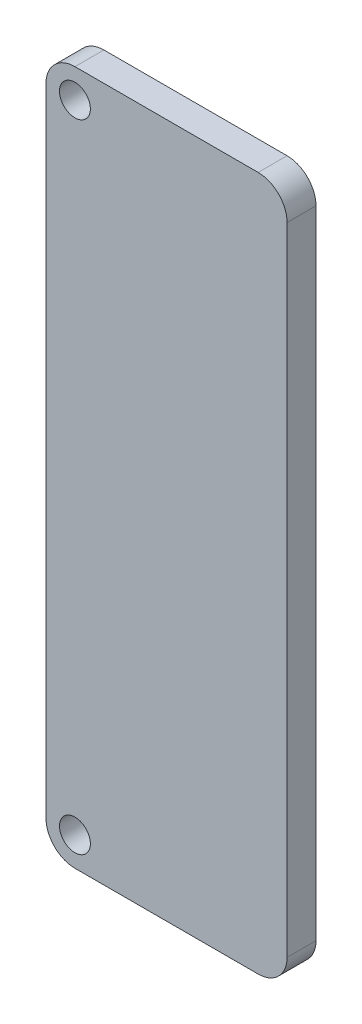
ISO-10303-21;
HEADER;
FILE_DESCRIPTION(('STEP AP214'),'2;1');
FILE_NAME('part.step','',(''),(''),'','','');
FILE_SCHEMA(('AUTOMOTIVE_DESIGN { 1 0 10303 214 1 1 1 1 }'));
ENDSEC;
DATA;
#1=APPLICATION_CONTEXT('core data for automotive mechanical design processes');
#2=APPLICATION_PROTOCOL_DEFINITION('international standard','automotive_design',2000,#1);
#3=PRODUCT_CONTEXT('',#1,'mechanical');
#4=PRODUCT('Part','Part','',(#3));
#5=PRODUCT_RELATED_PRODUCT_CATEGORY('part','',(#4));
#6=PRODUCT_DEFINITION_FORMATION('','',#4);
#7=PRODUCT_DEFINITION_CONTEXT('part definition',#1,'design');
#8=PRODUCT_DEFINITION('design','',#6,#7);
#9=PRODUCT_DEFINITION_SHAPE('','',#8);
#10=(LENGTH_UNIT() NAMED_UNIT(*) SI_UNIT(.MILLI.,.METRE.));
#11=(NAMED_UNIT(*) PLANE_ANGLE_UNIT() SI_UNIT($,.RADIAN.));
#12=(NAMED_UNIT(*) SI_UNIT($,.STERADIAN.) SOLID_ANGLE_UNIT());
#13=UNCERTAINTY_MEASURE_WITH_UNIT(LENGTH_MEASURE(1.E-05),#10,'distance_accuracy_value','');
#14=(GEOMETRIC_REPRESENTATION_CONTEXT(3) GLOBAL_UNCERTAINTY_ASSIGNED_CONTEXT((#13)) GLOBAL_UNIT_ASSIGNED_CONTEXT((#10,
#11,#12)) REPRESENTATION_CONTEXT('',''));
#15=CARTESIAN_POINT('',(0.,0.,0.));
#16=DIRECTION('',(0.,0.,1.));
#17=DIRECTION('',(1.,0.,0.));
#18=AXIS2_PLACEMENT_3D('',#15,#16,#17);
#19=CARTESIAN_POINT('',(-24.4,-30.5,2.));
#20=DIRECTION('',(-1.,0.,0.));
#21=DIRECTION('',(0.,0.,1.));
#22=AXIS2_PLACEMENT_3D('',#19,#20,#21);
#23=PLANE('',#22);
#24=DIRECTION('',(0.,1.,0.));
#25=VECTOR('',#24,1.);
#26=CARTESIAN_POINT('',(-24.4,-30.5,0.));
#27=LINE('',#26,#25);
#28=CARTESIAN_POINT('',(-24.4,-30.5,0.));
#29=VERTEX_POINT('',#28);
#30=CARTESIAN_POINT('',(-24.4,-4.25,0.));
#31=VERTEX_POINT('',#30);
#32=EDGE_CURVE('E302',#29,#31,#27,.T.);
#33=ORIENTED_EDGE('',*,*,#32,.T.);
#34=DIRECTION('',(0.,0.,1.));
#35=VECTOR('',#34,1.);
#36=CARTESIAN_POINT('',(-24.4,-4.25,2.));
#37=LINE('',#36,#35);
#38=CARTESIAN_POINT('',(-24.4,-4.25,2.));
#39=VERTEX_POINT('',#38);
#40=EDGE_CURVE('E261',#31,#39,#37,.T.);
#41=ORIENTED_EDGE('',*,*,#40,.T.);
#42=DIRECTION('',(0.,1.,0.));
#43=VECTOR('',#42,1.);
#44=CARTESIAN_POINT('',(-24.4,-30.5,2.));
#45=LINE('',#44,#43);
#46=CARTESIAN_POINT('',(-24.4,-30.5,2.));
#47=VERTEX_POINT('',#46);
#48=EDGE_CURVE('E276',#47,#39,#45,.T.);
#49=ORIENTED_EDGE('',*,*,#48,.F.);
#50=DIRECTION('',(0.,0.,-1.));
#51=VECTOR('',#50,1.);
#52=CARTESIAN_POINT('',(-24.4,-30.5,2.));
#53=LINE('',#52,#51);
#54=EDGE_CURVE('E326',#47,#29,#53,.T.);
#55=ORIENTED_EDGE('',*,*,#54,.T.);
#56=EDGE_LOOP('',(#33,#41,#49,#55));
#57=FACE_BOUND('',#56,.T.);
#58=ADVANCED_FACE('F43',(#57),#23,.F.);
#59=CARTESIAN_POINT('',(-22.,-33.,3.));
#60=DIRECTION('',(0.,0.,1.));
#61=DIRECTION('',(1.,0.,0.));
#62=AXIS2_PLACEMENT_3D('',#59,#60,#61);
#63=PLANE('',#62);
#64=CARTESIAN_POINT('',(-22.,33.,3.));
#65=DIRECTION('',(0.,0.,1.));
#66=DIRECTION('',(1.,0.,0.));
#67=AXIS2_PLACEMENT_3D('',#64,#65,#66);
#68=CIRCLE('',#67,1.6);
#69=CARTESIAN_POINT('',(-20.4,33.,3.));
#70=VERTEX_POINT('',#69);
#71=EDGE_CURVE('E353',#70,#70,#68,.T.);
#72=ORIENTED_EDGE('',*,*,#71,.F.);
#73=EDGE_LOOP('',(#72));
#74=FACE_BOUND('',#73,.T.);
#75=DIRECTION('',(1.,0.,0.));
#76=VECTOR('',#75,1.);
#77=CARTESIAN_POINT('',(0.,-36.,3.));
#78=LINE('',#77,#76);
#79=CARTESIAN_POINT('',(-22.,-36.,3.));
#80=VERTEX_POINT('',#79);
#81=CARTESIAN_POINT('',(-2.99999999999999,-36.,3.));
#82=VERTEX_POINT('',#81);
#83=EDGE_CURVE('E365',#80,#82,#78,.T.);
#84=ORIENTED_EDGE('',*,*,#83,.T.);
#85=CARTESIAN_POINT('',(-2.99999999999999,-33.,3.));
#86=DIRECTION('',(0.,0.,1.));
#87=DIRECTION('',(1.,0.,0.));
#88=AXIS2_PLACEMENT_3D('',#85,#86,#87);
#89=CIRCLE('',#88,3.);
#90=CARTESIAN_POINT('',(0.,-33.,3.));
#91=VERTEX_POINT('',#90);
#92=EDGE_CURVE('E52',#82,#91,#89,.T.);
#93=ORIENTED_EDGE('',*,*,#92,.T.);
#94=DIRECTION('',(0.,1.,0.));
#95=VECTOR('',#94,1.);
#96=CARTESIAN_POINT('',(0.,36.,3.));
#97=LINE('',#96,#95);
#98=CARTESIAN_POINT('',(0.,33.,3.));
#99=VERTEX_POINT('',#98);
#100=EDGE_CURVE('E369',#91,#99,#97,.T.);
#101=ORIENTED_EDGE('',*,*,#100,.T.);
#102=CARTESIAN_POINT('',(-3.,33.,3.));
#103=DIRECTION('',(0.,0.,1.));
#104=DIRECTION('',(1.,0.,0.));
#105=AXIS2_PLACEMENT_3D('',#102,#103,#104);
#106=CIRCLE('',#105,3.);
#107=CARTESIAN_POINT('',(-3.,36.,3.));
#108=VERTEX_POINT('',#107);
#109=EDGE_CURVE('E59',#99,#108,#106,.T.);
#110=ORIENTED_EDGE('',*,*,#109,.T.);
#111=DIRECTION('',(-1.,0.,0.));
#112=VECTOR('',#111,1.);
#113=CARTESIAN_POINT('',(0.,36.,3.));
#114=LINE('',#113,#112);
#115=CARTESIAN_POINT('',(-22.,36.,3.));
#116=VERTEX_POINT('',#115);
#117=EDGE_CURVE('E372',#108,#116,#114,.T.);
#118=ORIENTED_EDGE('',*,*,#117,.T.);
#119=CARTESIAN_POINT('',(-22.,33.,3.));
#120=DIRECTION('',(0.,0.,1.));
#121=DIRECTION('',(-1.,0.,0.));
#122=AXIS2_PLACEMENT_3D('',#119,#120,#121);
#123=CIRCLE('',#122,3.);
#124=CARTESIAN_POINT('',(-25.,33.,3.));
#125=VERTEX_POINT('',#124);
#126=EDGE_CURVE('E375',#116,#125,#123,.T.);
#127=ORIENTED_EDGE('',*,*,#126,.T.);
#128=DIRECTION('',(0.,-1.,0.));
#129=VECTOR('',#128,1.);
#130=CARTESIAN_POINT('',(-25.,-33.,3.));
#131=LINE('',#130,#129);
#132=CARTESIAN_POINT('',(-25.,-33.,3.));
#133=VERTEX_POINT('',#132);
#134=EDGE_CURVE('E378',#125,#133,#131,.T.);
#135=ORIENTED_EDGE('',*,*,#134,.T.);
#136=CARTESIAN_POINT('',(-22.,-33.,3.));
#137=DIRECTION('',(0.,0.,1.));
#138=DIRECTION('',(1.,0.,0.));
#139=AXIS2_PLACEMENT_3D('',#136,#137,#138);
#140=CIRCLE('',#139,3.);
#141=EDGE_CURVE('E361',#133,#80,#140,.T.);
#142=ORIENTED_EDGE('',*,*,#141,.T.);
#143=EDGE_LOOP('',(#84,#93,#101,#110,#118,#127,#135,#142));
#144=FACE_BOUND('',#143,.T.);
#145=CARTESIAN_POINT('',(-22.,-33.,3.));
#146=DIRECTION('',(0.,0.,1.));
#147=DIRECTION('',(1.,0.,0.));
#148=AXIS2_PLACEMENT_3D('',#145,#146,#147);
#149=CIRCLE('',#148,1.6);
#150=CARTESIAN_POINT('',(-20.4,-33.,3.));
#151=VERTEX_POINT('',#150);
#152=EDGE_CURVE('E345',#151,#151,#149,.T.);
#153=ORIENTED_EDGE('',*,*,#152,.F.);
#154=EDGE_LOOP('',(#153));
#155=FACE_BOUND('',#154,.T.);
#156=ADVANCED_FACE('F444',(#74,#144,#155),#63,.T.);
#157=CARTESIAN_POINT('',(-22.,-33.,0.));
#158=DIRECTION('',(0.,0.,1.));
#159=DIRECTION('',(1.,0.,0.));
#160=AXIS2_PLACEMENT_3D('',#157,#158,#159);
#161=PLANE('',#160);
#162=DIRECTION('',(0.,1.,0.));
#163=VECTOR('',#162,1.);
#164=CARTESIAN_POINT('',(0.,36.,0.));
#165=LINE('',#164,#163);
#166=CARTESIAN_POINT('',(0.,-33.,0.));
#167=VERTEX_POINT('',#166);
#168=CARTESIAN_POINT('',(0.,33.,0.));
#169=VERTEX_POINT('',#168);
#170=EDGE_CURVE('E388',#167,#169,#165,.T.);
#171=ORIENTED_EDGE('',*,*,#170,.F.);
#172=CARTESIAN_POINT('',(-2.99999999999999,-33.,0.));
#173=DIRECTION('',(0.,0.,1.));
#174=DIRECTION('',(1.,0.,0.));
#175=AXIS2_PLACEMENT_3D('',#172,#173,#174);
#176=CIRCLE('',#175,3.);
#177=CARTESIAN_POINT('',(-2.99999999999999,-36.,0.));
#178=VERTEX_POINT('',#177);
#179=EDGE_CURVE('E435',#167,#178,#176,.F.);
#180=ORIENTED_EDGE('',*,*,#179,.T.);
#181=DIRECTION('',(1.,0.,0.));
#182=VECTOR('',#181,1.);
#183=CARTESIAN_POINT('',(0.,-36.,0.));
#184=LINE('',#183,#182);
#185=CARTESIAN_POINT('',(-22.,-36.,0.));
#186=VERTEX_POINT('',#185);
#187=EDGE_CURVE('E385',#186,#178,#184,.T.);
#188=ORIENTED_EDGE('',*,*,#187,.F.);
#189=CARTESIAN_POINT('',(-22.,-33.,0.));
#190=DIRECTION('',(0.,0.,1.));
#191=DIRECTION('',(1.,0.,0.));
#192=AXIS2_PLACEMENT_3D('',#189,#190,#191);
#193=CIRCLE('',#192,3.);
#194=CARTESIAN_POINT('',(-25.,-33.,0.));
#195=VERTEX_POINT('',#194);
#196=EDGE_CURVE('E357',#195,#186,#193,.T.);
#197=ORIENTED_EDGE('',*,*,#196,.F.);
#198=DIRECTION('',(0.,-1.,0.));
#199=VECTOR('',#198,1.);
#200=CARTESIAN_POINT('',(-25.,-33.,0.));
#201=LINE('',#200,#199);
#202=CARTESIAN_POINT('',(-25.,-4.25,0.));
#203=VERTEX_POINT('',#202);
#204=EDGE_CURVE('E398',#203,#195,#201,.T.);
#205=ORIENTED_EDGE('',*,*,#204,.F.);
#206=DIRECTION('',(-1.,0.,0.));
#207=VECTOR('',#206,1.);
#208=CARTESIAN_POINT('',(-25.,-4.25,0.));
#209=LINE('',#208,#207);
#210=EDGE_CURVE('E240',#31,#203,#209,.T.);
#211=ORIENTED_EDGE('',*,*,#210,.F.);
#212=ORIENTED_EDGE('',*,*,#32,.F.);
#213=DIRECTION('',(-1.,0.,0.));
#214=VECTOR('',#213,1.);
#215=CARTESIAN_POINT('',(-3.,-30.5,0.));
#216=LINE('',#215,#214);
#217=CARTESIAN_POINT('',(-3.,-30.5,0.));
#218=VERTEX_POINT('',#217);
#219=EDGE_CURVE('E322',#218,#29,#216,.T.);
#220=ORIENTED_EDGE('',*,*,#219,.F.);
#221=DIRECTION('',(0.,-1.,0.));
#222=VECTOR('',#221,1.);
#223=CARTESIAN_POINT('',(-3.,-3.,0.));
#224=LINE('',#223,#222);
#225=CARTESIAN_POINT('',(-3.,-3.,0.));
#226=VERTEX_POINT('',#225);
#227=EDGE_CURVE('E318',#226,#218,#224,.T.);
#228=ORIENTED_EDGE('',*,*,#227,.F.);
#229=DIRECTION('',(1.,0.,0.));
#230=VECTOR('',#229,1.);
#231=CARTESIAN_POINT('',(-12.,-2.99999999999999,0.));
#232=LINE('',#231,#230);
#233=CARTESIAN_POINT('',(-12.,-2.99999999999999,0.));
#234=VERTEX_POINT('',#233);
#235=EDGE_CURVE('E314',#234,#226,#232,.T.);
#236=ORIENTED_EDGE('',*,*,#235,.F.);
#237=DIRECTION('',(0.,-1.,0.));
#238=VECTOR('',#237,1.);
#239=CARTESIAN_POINT('',(-12.,30.,0.));
#240=LINE('',#239,#238);
#241=CARTESIAN_POINT('',(-12.,30.,0.));
#242=VERTEX_POINT('',#241);
#243=EDGE_CURVE('E310',#242,#234,#240,.T.);
#244=ORIENTED_EDGE('',*,*,#243,.F.);
#245=DIRECTION('',(1.,0.,0.));
#246=VECTOR('',#245,1.);
#247=CARTESIAN_POINT('',(-24.4,30.,0.));
#248=LINE('',#247,#246);
#249=CARTESIAN_POINT('',(-24.4,30.,0.));
#250=VERTEX_POINT('',#249);
#251=EDGE_CURVE('E306',#250,#242,#248,.T.);
#252=ORIENTED_EDGE('',*,*,#251,.F.);
#253=CARTESIAN_POINT('',(-24.4,7.25,0.));
#254=VERTEX_POINT('',#253);
#255=EDGE_CURVE('E204',#254,#250,#27,.T.);
#256=ORIENTED_EDGE('',*,*,#255,.F.);
#257=DIRECTION('',(1.,0.,0.));
#258=VECTOR('',#257,1.);
#259=CARTESIAN_POINT('',(-25.,7.25,0.));
#260=LINE('',#259,#258);
#261=CARTESIAN_POINT('',(-21.,7.25,0.));
#262=VERTEX_POINT('',#261);
#263=EDGE_CURVE('E195',#254,#262,#260,.T.);
#264=ORIENTED_EDGE('',*,*,#263,.T.);
#265=DIRECTION('',(0.,-1.,0.));
#266=VECTOR('',#265,1.);
#267=CARTESIAN_POINT('',(-21.,4.25,0.));
#268=LINE('',#267,#266);
#269=CARTESIAN_POINT('',(-21.,4.25,0.));
#270=VERTEX_POINT('',#269);
#271=EDGE_CURVE('E202',#262,#270,#268,.T.);
#272=ORIENTED_EDGE('',*,*,#271,.T.);
#273=DIRECTION('',(1.,0.,0.));
#274=VECTOR('',#273,1.);
#275=CARTESIAN_POINT('',(-25.,4.25,0.));
#276=LINE('',#275,#274);
#277=CARTESIAN_POINT('',(-25.,4.25,0.));
#278=VERTEX_POINT('',#277);
#279=EDGE_CURVE('E234',#278,#270,#276,.T.);
#280=ORIENTED_EDGE('',*,*,#279,.F.);
#281=CARTESIAN_POINT('',(-25.,33.,0.));
#282=VERTEX_POINT('',#281);
#283=EDGE_CURVE('E366',#282,#278,#201,.T.);
#284=ORIENTED_EDGE('',*,*,#283,.F.);
#285=CARTESIAN_POINT('',(-22.,33.,0.));
#286=DIRECTION('',(0.,0.,1.));
#287=DIRECTION('',(-1.,0.,0.));
#288=AXIS2_PLACEMENT_3D('',#285,#286,#287);
#289=CIRCLE('',#288,3.);
#290=CARTESIAN_POINT('',(-22.,36.,0.));
#291=VERTEX_POINT('',#290);
#292=EDGE_CURVE('E395',#291,#282,#289,.T.);
#293=ORIENTED_EDGE('',*,*,#292,.F.);
#294=DIRECTION('',(-1.,0.,0.));
#295=VECTOR('',#294,1.);
#296=CARTESIAN_POINT('',(0.,36.,0.));
#297=LINE('',#296,#295);
#298=CARTESIAN_POINT('',(-3.,36.,0.));
#299=VERTEX_POINT('',#298);
#300=EDGE_CURVE('E392',#299,#291,#297,.T.);
#301=ORIENTED_EDGE('',*,*,#300,.F.);
#302=CARTESIAN_POINT('',(-3.,33.,0.));
#303=DIRECTION('',(0.,0.,1.));
#304=DIRECTION('',(1.,0.,0.));
#305=AXIS2_PLACEMENT_3D('',#302,#303,#304);
#306=CIRCLE('',#305,3.);
#307=EDGE_CURVE('E432',#299,#169,#306,.F.);
#308=ORIENTED_EDGE('',*,*,#307,.T.);
#309=EDGE_LOOP('',(#171,#180,#188,#197,#205,#211,#212,#220,#228,#236,#244,#252,#256,#264,#272,
#280,#284,#293,#301,#308));
#310=FACE_BOUND('',#309,.T.);
#311=CARTESIAN_POINT('',(-22.,33.,0.));
#312=DIRECTION('',(0.,0.,1.));
#313=DIRECTION('',(1.,0.,0.));
#314=AXIS2_PLACEMENT_3D('',#311,#312,#313);
#315=CIRCLE('',#314,1.6);
#316=CARTESIAN_POINT('',(-20.4,33.,0.));
#317=VERTEX_POINT('',#316);
#318=EDGE_CURVE('E349',#317,#317,#315,.T.);
#319=ORIENTED_EDGE('',*,*,#318,.T.);
#320=EDGE_LOOP('',(#319));
#321=FACE_BOUND('',#320,.T.);
#322=CARTESIAN_POINT('',(-22.,-33.,0.));
#323=DIRECTION('',(0.,0.,1.));
#324=DIRECTION('',(1.,0.,0.));
#325=AXIS2_PLACEMENT_3D('',#322,#323,#324);
#326=CIRCLE('',#325,1.6);
#327=CARTESIAN_POINT('',(-20.4,-33.,0.));
#328=VERTEX_POINT('',#327);
#329=EDGE_CURVE('E329',#328,#328,#326,.T.);
#330=ORIENTED_EDGE('',*,*,#329,.T.);
#331=EDGE_LOOP('',(#330));
#332=FACE_BOUND('',#331,.T.);
#333=ADVANCED_FACE('F198',(#310,#321,#332),#161,.F.);
#334=CARTESIAN_POINT('',(-22.,-33.,3.));
#335=DIRECTION('',(0.,0.,-1.));
#336=DIRECTION('',(-1.,0.,0.));
#337=AXIS2_PLACEMENT_3D('',#334,#335,#336);
#338=CYLINDRICAL_SURFACE('',#337,3.);
#339=ORIENTED_EDGE('',*,*,#196,.T.);
#340=DIRECTION('',(0.,0.,-1.));
#341=VECTOR('',#340,1.);
#342=CARTESIAN_POINT('',(-22.,-36.,3.));
#343=LINE('',#342,#341);
#344=EDGE_CURVE('E412',#80,#186,#343,.T.);
#345=ORIENTED_EDGE('',*,*,#344,.F.);
#346=ORIENTED_EDGE('',*,*,#141,.F.);
#347=DIRECTION('',(0.,0.,-1.));
#348=VECTOR('',#347,1.);
#349=CARTESIAN_POINT('',(-25.,-33.,3.));
#350=LINE('',#349,#348);
#351=EDGE_CURVE('E381',#133,#195,#350,.T.);
#352=ORIENTED_EDGE('',*,*,#351,.T.);
#353=EDGE_LOOP('',(#339,#345,#346,#352));
#354=FACE_BOUND('',#353,.T.);
#355=ADVANCED_FACE('F457',(#354),#338,.T.);
#356=CARTESIAN_POINT('',(0.,-36.,3.));
#357=DIRECTION('',(0.,1.,0.));
#358=DIRECTION('',(-1.,0.,0.));
#359=AXIS2_PLACEMENT_3D('',#356,#357,#358);
#360=PLANE('',#359);
#361=ORIENTED_EDGE('',*,*,#187,.T.);
#362=DIRECTION('',(0.,0.,-1.));
#363=VECTOR('',#362,1.);
#364=CARTESIAN_POINT('',(-2.99999999999999,-36.,3.));
#365=LINE('',#364,#363);
#366=EDGE_CURVE('E67',#178,#82,#365,.F.);
#367=ORIENTED_EDGE('',*,*,#366,.T.);
#368=ORIENTED_EDGE('',*,*,#83,.F.);
#369=ORIENTED_EDGE('',*,*,#344,.T.);
#370=EDGE_LOOP('',(#361,#367,#368,#369));
#371=FACE_BOUND('',#370,.T.);
#372=ADVANCED_FACE('F453',(#371),#360,.F.);
#373=CARTESIAN_POINT('',(0.,36.,3.));
#374=DIRECTION('',(-1.,0.,0.));
#375=DIRECTION('',(0.,-1.,0.));
#376=AXIS2_PLACEMENT_3D('',#373,#374,#375);
#377=PLANE('',#376);
#378=ORIENTED_EDGE('',*,*,#100,.F.);
#379=DIRECTION('',(0.,0.,-1.));
#380=VECTOR('',#379,1.);
#381=CARTESIAN_POINT('',(0.,-33.,3.));
#382=LINE('',#381,#380);
#383=EDGE_CURVE('E428',#91,#167,#382,.T.);
#384=ORIENTED_EDGE('',*,*,#383,.T.);
#385=ORIENTED_EDGE('',*,*,#170,.T.);
#386=DIRECTION('',(0.,0.,-1.));
#387=VECTOR('',#386,1.);
#388=CARTESIAN_POINT('',(0.,33.,3.));
#389=LINE('',#388,#387);
#390=EDGE_CURVE('E425',#169,#99,#389,.F.);
#391=ORIENTED_EDGE('',*,*,#390,.T.);
#392=EDGE_LOOP('',(#378,#384,#385,#391));
#393=FACE_BOUND('',#392,.T.);
#394=ADVANCED_FACE('F449',(#393),#377,.F.);
#395=CARTESIAN_POINT('',(0.,36.,3.));
#396=DIRECTION('',(0.,-1.,0.));
#397=DIRECTION('',(0.,0.,-1.));
#398=AXIS2_PLACEMENT_3D('',#395,#396,#397);
#399=PLANE('',#398);
#400=ORIENTED_EDGE('',*,*,#117,.F.);
#401=DIRECTION('',(0.,0.,-1.));
#402=VECTOR('',#401,1.);
#403=CARTESIAN_POINT('',(-3.,36.,3.));
#404=LINE('',#403,#402);
#405=EDGE_CURVE('E11',#108,#299,#404,.T.);
#406=ORIENTED_EDGE('',*,*,#405,.T.);
#407=ORIENTED_EDGE('',*,*,#300,.T.);
#408=DIRECTION('',(0.,0.,-1.));
#409=VECTOR('',#408,1.);
#410=CARTESIAN_POINT('',(-22.,36.,3.));
#411=LINE('',#410,#409);
#412=EDGE_CURVE('E408',#116,#291,#411,.T.);
#413=ORIENTED_EDGE('',*,*,#412,.F.);
#414=EDGE_LOOP('',(#400,#406,#407,#413));
#415=FACE_BOUND('',#414,.T.);
#416=ADVANCED_FACE('F494',(#415),#399,.F.);
#417=CARTESIAN_POINT('',(-22.,33.,3.));
#418=DIRECTION('',(0.,0.,-1.));
#419=DIRECTION('',(-1.,0.,0.));
#420=AXIS2_PLACEMENT_3D('',#417,#418,#419);
#421=CYLINDRICAL_SURFACE('',#420,3.);
#422=ORIENTED_EDGE('',*,*,#292,.T.);
#423=DIRECTION('',(0.,0.,-1.));
#424=VECTOR('',#423,1.);
#425=CARTESIAN_POINT('',(-25.,33.,3.));
#426=LINE('',#425,#424);
#427=EDGE_CURVE('E404',#125,#282,#426,.T.);
#428=ORIENTED_EDGE('',*,*,#427,.F.);
#429=ORIENTED_EDGE('',*,*,#126,.F.);
#430=ORIENTED_EDGE('',*,*,#412,.T.);
#431=EDGE_LOOP('',(#422,#428,#429,#430));
#432=FACE_BOUND('',#431,.T.);
#433=ADVANCED_FACE('F491',(#432),#421,.T.);
#434=CARTESIAN_POINT('',(-25.,-33.,3.));
#435=DIRECTION('',(1.,0.,0.));
#436=DIRECTION('',(0.,1.,0.));
#437=AXIS2_PLACEMENT_3D('',#434,#435,#436);
#438=PLANE('',#437);
#439=ORIENTED_EDGE('',*,*,#283,.T.);
#440=DIRECTION('',(0.,0.,-1.));
#441=VECTOR('',#440,1.);
#442=CARTESIAN_POINT('',(-25.,4.25,2.7));
#443=LINE('',#442,#441);
#444=CARTESIAN_POINT('',(-25.,4.25,2.7));
#445=VERTEX_POINT('',#444);
#446=EDGE_CURVE('E252',#445,#278,#443,.T.);
#447=ORIENTED_EDGE('',*,*,#446,.F.);
#448=DIRECTION('',(0.,1.,0.));
#449=VECTOR('',#448,1.);
#450=CARTESIAN_POINT('',(-25.,4.25,2.7));
#451=LINE('',#450,#449);
#452=CARTESIAN_POINT('',(-25.,-4.25,2.7));
#453=VERTEX_POINT('',#452);
#454=EDGE_CURVE('E235',#453,#445,#451,.T.);
#455=ORIENTED_EDGE('',*,*,#454,.F.);
#456=DIRECTION('',(0.,0.,-1.));
#457=VECTOR('',#456,1.);
#458=CARTESIAN_POINT('',(-25.,-4.25,2.7));
#459=LINE('',#458,#457);
#460=EDGE_CURVE('E257',#453,#203,#459,.T.);
#461=ORIENTED_EDGE('',*,*,#460,.T.);
#462=ORIENTED_EDGE('',*,*,#204,.T.);
#463=ORIENTED_EDGE('',*,*,#351,.F.);
#464=ORIENTED_EDGE('',*,*,#134,.F.);
#465=ORIENTED_EDGE('',*,*,#427,.T.);
#466=EDGE_LOOP('',(#439,#447,#455,#461,#462,#463,#464,#465));
#467=FACE_BOUND('',#466,.T.);
#468=ADVANCED_FACE('F486',(#467),#438,.F.);
#469=CARTESIAN_POINT('',(-22.,33.,3.));
#470=DIRECTION('',(0.,0.,-1.));
#471=DIRECTION('',(-1.,0.,0.));
#472=AXIS2_PLACEMENT_3D('',#469,#470,#471);
#473=CYLINDRICAL_SURFACE('',#472,1.6);
#474=ORIENTED_EDGE('',*,*,#71,.T.);
#475=EDGE_LOOP('',(#474));
#476=FACE_BOUND('',#475,.T.);
#477=ORIENTED_EDGE('',*,*,#318,.F.);
#478=EDGE_LOOP('',(#477));
#479=FACE_BOUND('',#478,.T.);
#480=ADVANCED_FACE('F524',(#476,#479),#473,.F.);
#481=CARTESIAN_POINT('',(-22.,-33.,3.));
#482=DIRECTION('',(0.,0.,-1.));
#483=DIRECTION('',(-1.,0.,0.));
#484=AXIS2_PLACEMENT_3D('',#481,#482,#483);
#485=CYLINDRICAL_SURFACE('',#484,1.6);
#486=ORIENTED_EDGE('',*,*,#152,.T.);
#487=EDGE_LOOP('',(#486));
#488=FACE_BOUND('',#487,.T.);
#489=ORIENTED_EDGE('',*,*,#329,.F.);
#490=EDGE_LOOP('',(#489));
#491=FACE_BOUND('',#490,.T.);
#492=ADVANCED_FACE('F516',(#488,#491),#485,.F.);
#493=CARTESIAN_POINT('',(-24.4,7.25,2.));
#494=VERTEX_POINT('',#493);
#495=CARTESIAN_POINT('',(-24.4,30.,2.));
#496=VERTEX_POINT('',#495);
#497=EDGE_CURVE('E281',#494,#496,#45,.T.);
#498=ORIENTED_EDGE('',*,*,#497,.F.);
#499=DIRECTION('',(0.,0.,-1.));
#500=VECTOR('',#499,1.);
#501=CARTESIAN_POINT('',(-24.4,7.25000000000001,2.));
#502=LINE('',#501,#500);
#503=EDGE_CURVE('E231',#494,#254,#502,.T.);
#504=ORIENTED_EDGE('',*,*,#503,.T.);
#505=ORIENTED_EDGE('',*,*,#255,.T.);
#506=DIRECTION('',(0.,0.,-1.));
#507=VECTOR('',#506,1.);
#508=CARTESIAN_POINT('',(-24.4,30.,2.));
#509=LINE('',#508,#507);
#510=EDGE_CURVE('E301',#496,#250,#509,.T.);
#511=ORIENTED_EDGE('',*,*,#510,.F.);
#512=EDGE_LOOP('',(#498,#504,#505,#511));
#513=FACE_BOUND('',#512,.T.);
#514=ADVANCED_FACE('F504',(#513),#23,.F.);
#515=CARTESIAN_POINT('',(-3.,-30.5,2.));
#516=DIRECTION('',(0.,-1.,0.));
#517=DIRECTION('',(0.,0.,-1.));
#518=AXIS2_PLACEMENT_3D('',#515,#516,#517);
#519=PLANE('',#518);
#520=ORIENTED_EDGE('',*,*,#219,.T.);
#521=ORIENTED_EDGE('',*,*,#54,.F.);
#522=DIRECTION('',(-1.,0.,0.));
#523=VECTOR('',#522,1.);
#524=CARTESIAN_POINT('',(-3.,-30.5,2.));
#525=LINE('',#524,#523);
#526=CARTESIAN_POINT('',(-3.,-30.5,2.));
#527=VERTEX_POINT('',#526);
#528=EDGE_CURVE('E297',#527,#47,#525,.T.);
#529=ORIENTED_EDGE('',*,*,#528,.F.);
#530=DIRECTION('',(0.,0.,-1.));
#531=VECTOR('',#530,1.);
#532=CARTESIAN_POINT('',(-3.,-30.5,2.));
#533=LINE('',#532,#531);
#534=EDGE_CURVE('E330',#527,#218,#533,.T.);
#535=ORIENTED_EDGE('',*,*,#534,.T.);
#536=EDGE_LOOP('',(#520,#521,#529,#535));
#537=FACE_BOUND('',#536,.T.);
#538=ADVANCED_FACE('F515',(#537),#519,.F.);
#539=CARTESIAN_POINT('',(-3.,-3.,2.));
#540=DIRECTION('',(1.,0.,0.));
#541=DIRECTION('',(0.,1.,0.));
#542=AXIS2_PLACEMENT_3D('',#539,#540,#541);
#543=PLANE('',#542);
#544=ORIENTED_EDGE('',*,*,#227,.T.);
#545=ORIENTED_EDGE('',*,*,#534,.F.);
#546=DIRECTION('',(0.,-1.,0.));
#547=VECTOR('',#546,1.);
#548=CARTESIAN_POINT('',(-3.,-3.,2.));
#549=LINE('',#548,#547);
#550=CARTESIAN_POINT('',(-3.,-3.,2.));
#551=VERTEX_POINT('',#550);
#552=EDGE_CURVE('E293',#551,#527,#549,.T.);
#553=ORIENTED_EDGE('',*,*,#552,.F.);
#554=DIRECTION('',(0.,0.,-1.));
#555=VECTOR('',#554,1.);
#556=CARTESIAN_POINT('',(-3.,-3.,2.));
#557=LINE('',#556,#555);
#558=EDGE_CURVE('E333',#551,#226,#557,.T.);
#559=ORIENTED_EDGE('',*,*,#558,.T.);
#560=EDGE_LOOP('',(#544,#545,#553,#559));
#561=FACE_BOUND('',#560,.T.);
#562=ADVANCED_FACE('F521',(#561),#543,.F.);
#563=CARTESIAN_POINT('',(-12.,-2.99999999999999,2.));
#564=DIRECTION('',(0.,1.,0.));
#565=DIRECTION('',(-1.,0.,0.));
#566=AXIS2_PLACEMENT_3D('',#563,#564,#565);
#567=PLANE('',#566);
#568=ORIENTED_EDGE('',*,*,#235,.T.);
#569=ORIENTED_EDGE('',*,*,#558,.F.);
#570=DIRECTION('',(1.,0.,0.));
#571=VECTOR('',#570,1.);
#572=CARTESIAN_POINT('',(-12.,-2.99999999999999,2.));
#573=LINE('',#572,#571);
#574=CARTESIAN_POINT('',(-12.,-2.99999999999999,2.));
#575=VERTEX_POINT('',#574);
#576=EDGE_CURVE('E289',#575,#551,#573,.T.);
#577=ORIENTED_EDGE('',*,*,#576,.F.);
#578=DIRECTION('',(0.,0.,-1.));
#579=VECTOR('',#578,1.);
#580=CARTESIAN_POINT('',(-12.,-2.99999999999999,2.));
#581=LINE('',#580,#579);
#582=EDGE_CURVE('E336',#575,#234,#581,.T.);
#583=ORIENTED_EDGE('',*,*,#582,.T.);
#584=EDGE_LOOP('',(#568,#569,#577,#583));
#585=FACE_BOUND('',#584,.T.);
#586=ADVANCED_FACE('F537',(#585),#567,.F.);
#587=CARTESIAN_POINT('',(-12.,30.,2.));
#588=DIRECTION('',(1.,0.,0.));
#589=DIRECTION('',(0.,1.,0.));
#590=AXIS2_PLACEMENT_3D('',#587,#588,#589);
#591=PLANE('',#590);
#592=ORIENTED_EDGE('',*,*,#243,.T.);
#593=ORIENTED_EDGE('',*,*,#582,.F.);
#594=DIRECTION('',(0.,-1.,0.));
#595=VECTOR('',#594,1.);
#596=CARTESIAN_POINT('',(-12.,30.,2.));
#597=LINE('',#596,#595);
#598=CARTESIAN_POINT('',(-12.,30.,2.));
#599=VERTEX_POINT('',#598);
#600=EDGE_CURVE('E285',#599,#575,#597,.T.);
#601=ORIENTED_EDGE('',*,*,#600,.F.);
#602=DIRECTION('',(0.,0.,-1.));
#603=VECTOR('',#602,1.);
#604=CARTESIAN_POINT('',(-12.,30.,2.));
#605=LINE('',#604,#603);
#606=EDGE_CURVE('E339',#599,#242,#605,.T.);
#607=ORIENTED_EDGE('',*,*,#606,.T.);
#608=EDGE_LOOP('',(#592,#593,#601,#607));
#609=FACE_BOUND('',#608,.T.);
#610=ADVANCED_FACE('F533',(#609),#591,.F.);
#611=CARTESIAN_POINT('',(-24.4,30.,2.));
#612=DIRECTION('',(0.,1.,0.));
#613=DIRECTION('',(0.,0.,1.));
#614=AXIS2_PLACEMENT_3D('',#611,#612,#613);
#615=PLANE('',#614);
#616=ORIENTED_EDGE('',*,*,#251,.T.);
#617=ORIENTED_EDGE('',*,*,#606,.F.);
#618=DIRECTION('',(1.,0.,0.));
#619=VECTOR('',#618,1.);
#620=CARTESIAN_POINT('',(-24.4,30.,2.));
#621=LINE('',#620,#619);
#622=EDGE_CURVE('E280',#496,#599,#621,.T.);
#623=ORIENTED_EDGE('',*,*,#622,.F.);
#624=ORIENTED_EDGE('',*,*,#510,.T.);
#625=EDGE_LOOP('',(#616,#617,#623,#624));
#626=FACE_BOUND('',#625,.T.);
#627=ADVANCED_FACE('F530',(#626),#615,.F.);
#628=CARTESIAN_POINT('',(0.,0.,2.));
#629=DIRECTION('',(0.,0.,-1.));
#630=DIRECTION('',(-1.,0.,0.));
#631=AXIS2_PLACEMENT_3D('',#628,#629,#630);
#632=PLANE('',#631);
#633=DIRECTION('',(0.,1.,0.));
#634=VECTOR('',#633,1.);
#635=CARTESIAN_POINT('',(-21.,4.25,2.));
#636=LINE('',#635,#634);
#637=CARTESIAN_POINT('',(-21.,4.25,2.));
#638=VERTEX_POINT('',#637);
#639=CARTESIAN_POINT('',(-21.,7.25,2.));
#640=VERTEX_POINT('',#639);
#641=EDGE_CURVE('E227',#638,#640,#636,.T.);
#642=ORIENTED_EDGE('',*,*,#641,.T.);
#643=DIRECTION('',(-1.,0.,0.));
#644=VECTOR('',#643,1.);
#645=CARTESIAN_POINT('',(-25.,7.25,2.));
#646=LINE('',#645,#644);
#647=EDGE_CURVE('E213',#640,#494,#646,.T.);
#648=ORIENTED_EDGE('',*,*,#647,.T.);
#649=ORIENTED_EDGE('',*,*,#497,.T.);
#650=ORIENTED_EDGE('',*,*,#622,.T.);
#651=ORIENTED_EDGE('',*,*,#600,.T.);
#652=ORIENTED_EDGE('',*,*,#576,.T.);
#653=ORIENTED_EDGE('',*,*,#552,.T.);
#654=ORIENTED_EDGE('',*,*,#528,.T.);
#655=ORIENTED_EDGE('',*,*,#48,.T.);
#656=DIRECTION('',(-1.,0.,0.));
#657=VECTOR('',#656,1.);
#658=CARTESIAN_POINT('',(0.,-4.25,2.));
#659=LINE('',#658,#657);
#660=CARTESIAN_POINT('',(-20.,-4.25,2.));
#661=VERTEX_POINT('',#660);
#662=EDGE_CURVE('E422',#661,#39,#659,.T.);
#663=ORIENTED_EDGE('',*,*,#662,.F.);
#664=DIRECTION('',(0.,-1.,0.));
#665=VECTOR('',#664,1.);
#666=CARTESIAN_POINT('',(-20.,0.,2.));
#667=LINE('',#666,#665);
#668=CARTESIAN_POINT('',(-20.,4.25,2.));
#669=VERTEX_POINT('',#668);
#670=EDGE_CURVE('E419',#669,#661,#667,.T.);
#671=ORIENTED_EDGE('',*,*,#670,.F.);
#672=DIRECTION('',(1.,0.,0.));
#673=VECTOR('',#672,1.);
#674=CARTESIAN_POINT('',(0.,4.24999999999998,2.));
#675=LINE('',#674,#673);
#676=EDGE_CURVE('E416',#638,#669,#675,.T.);
#677=ORIENTED_EDGE('',*,*,#676,.F.);
#678=EDGE_LOOP('',(#642,#648,#649,#650,#651,#652,#653,#654,#655,#663,#671,#677));
#679=FACE_BOUND('',#678,.T.);
#680=ADVANCED_FACE('F469',(#679),#632,.T.);
#681=CARTESIAN_POINT('',(-25.,-4.25,2.7));
#682=DIRECTION('',(0.,-1.,0.));
#683=DIRECTION('',(1.,0.,0.));
#684=AXIS2_PLACEMENT_3D('',#681,#682,#683);
#685=PLANE('',#684);
#686=ORIENTED_EDGE('',*,*,#210,.T.);
#687=ORIENTED_EDGE('',*,*,#460,.F.);
#688=DIRECTION('',(-1.,0.,0.));
#689=VECTOR('',#688,1.);
#690=CARTESIAN_POINT('',(-25.,-4.25,2.7));
#691=LINE('',#690,#689);
#692=CARTESIAN_POINT('',(-20.,-4.25,2.7));
#693=VERTEX_POINT('',#692);
#694=EDGE_CURVE('E248',#693,#453,#691,.T.);
#695=ORIENTED_EDGE('',*,*,#694,.F.);
#696=DIRECTION('',(0.,0.,-1.));
#697=VECTOR('',#696,1.);
#698=CARTESIAN_POINT('',(-20.,-4.25,2.7));
#699=LINE('',#698,#697);
#700=EDGE_CURVE('E262',#693,#661,#699,.T.);
#701=ORIENTED_EDGE('',*,*,#700,.T.);
#702=ORIENTED_EDGE('',*,*,#662,.T.);
#703=ORIENTED_EDGE('',*,*,#40,.F.);
#704=EDGE_LOOP('',(#686,#687,#695,#701,#702,#703));
#705=FACE_BOUND('',#704,.T.);
#706=ADVANCED_FACE('F544',(#705),#685,.F.);
#707=CARTESIAN_POINT('',(-25.,4.25,2.7));
#708=DIRECTION('',(0.,1.,0.));
#709=DIRECTION('',(-1.,0.,0.));
#710=AXIS2_PLACEMENT_3D('',#707,#708,#709);
#711=PLANE('',#710);
#712=ORIENTED_EDGE('',*,*,#279,.T.);
#713=DIRECTION('',(0.,0.,-1.));
#714=VECTOR('',#713,1.);
#715=CARTESIAN_POINT('',(-21.,4.25,7.));
#716=LINE('',#715,#714);
#717=EDGE_CURVE('E218',#638,#270,#716,.T.);
#718=ORIENTED_EDGE('',*,*,#717,.F.);
#719=ORIENTED_EDGE('',*,*,#676,.T.);
#720=DIRECTION('',(0.,0.,-1.));
#721=VECTOR('',#720,1.);
#722=CARTESIAN_POINT('',(-20.,4.25,2.7));
#723=LINE('',#722,#721);
#724=CARTESIAN_POINT('',(-20.,4.25,2.7));
#725=VERTEX_POINT('',#724);
#726=EDGE_CURVE('E266',#725,#669,#723,.T.);
#727=ORIENTED_EDGE('',*,*,#726,.F.);
#728=DIRECTION('',(1.,0.,0.));
#729=VECTOR('',#728,1.);
#730=CARTESIAN_POINT('',(-25.,4.25,2.7));
#731=LINE('',#730,#729);
#732=EDGE_CURVE('E239',#445,#725,#731,.T.);
#733=ORIENTED_EDGE('',*,*,#732,.F.);
#734=ORIENTED_EDGE('',*,*,#446,.T.);
#735=EDGE_LOOP('',(#712,#718,#719,#727,#733,#734));
#736=FACE_BOUND('',#735,.T.);
#737=ADVANCED_FACE('F474',(#736),#711,.F.);
#738=CARTESIAN_POINT('',(-20.,4.25,2.7));
#739=DIRECTION('',(1.,0.,0.));
#740=DIRECTION('',(0.,1.,0.));
#741=AXIS2_PLACEMENT_3D('',#738,#739,#740);
#742=PLANE('',#741);
#743=ORIENTED_EDGE('',*,*,#670,.T.);
#744=ORIENTED_EDGE('',*,*,#700,.F.);
#745=DIRECTION('',(0.,-1.,0.));
#746=VECTOR('',#745,1.);
#747=CARTESIAN_POINT('',(-20.,4.25,2.7));
#748=LINE('',#747,#746);
#749=EDGE_CURVE('E244',#725,#693,#748,.T.);
#750=ORIENTED_EDGE('',*,*,#749,.F.);
#751=ORIENTED_EDGE('',*,*,#726,.T.);
#752=EDGE_LOOP('',(#743,#744,#750,#751));
#753=FACE_BOUND('',#752,.T.);
#754=ADVANCED_FACE('F477',(#753),#742,.F.);
#755=CARTESIAN_POINT('',(0.,0.,2.7));
#756=DIRECTION('',(0.,0.,1.));
#757=DIRECTION('',(1.,0.,0.));
#758=AXIS2_PLACEMENT_3D('',#755,#756,#757);
#759=PLANE('',#758);
#760=ORIENTED_EDGE('',*,*,#454,.T.);
#761=ORIENTED_EDGE('',*,*,#732,.T.);
#762=ORIENTED_EDGE('',*,*,#749,.T.);
#763=ORIENTED_EDGE('',*,*,#694,.T.);
#764=EDGE_LOOP('',(#760,#761,#762,#763));
#765=FACE_BOUND('',#764,.T.);
#766=ADVANCED_FACE('F480',(#765),#759,.F.);
#767=CARTESIAN_POINT('',(-25.,7.25,7.));
#768=DIRECTION('',(0.,1.,0.));
#769=DIRECTION('',(-1.,0.,0.));
#770=AXIS2_PLACEMENT_3D('',#767,#768,#769);
#771=PLANE('',#770);
#772=ORIENTED_EDGE('',*,*,#503,.F.);
#773=ORIENTED_EDGE('',*,*,#647,.F.);
#774=DIRECTION('',(0.,0.,-1.));
#775=VECTOR('',#774,1.);
#776=CARTESIAN_POINT('',(-21.,7.25,7.));
#777=LINE('',#776,#775);
#778=EDGE_CURVE('E210',#640,#262,#777,.T.);
#779=ORIENTED_EDGE('',*,*,#778,.T.);
#780=ORIENTED_EDGE('',*,*,#263,.F.);
#781=EDGE_LOOP('',(#772,#773,#779,#780));
#782=FACE_BOUND('',#781,.T.);
#783=ADVANCED_FACE('F211',(#782),#771,.T.);
#784=CARTESIAN_POINT('',(-21.,4.25,7.));
#785=DIRECTION('',(1.,0.,0.));
#786=DIRECTION('',(0.,0.,-1.));
#787=AXIS2_PLACEMENT_3D('',#784,#785,#786);
#788=PLANE('',#787);
#789=ORIENTED_EDGE('',*,*,#641,.F.);
#790=ORIENTED_EDGE('',*,*,#717,.T.);
#791=ORIENTED_EDGE('',*,*,#271,.F.);
#792=ORIENTED_EDGE('',*,*,#778,.F.);
#793=EDGE_LOOP('',(#789,#790,#791,#792));
#794=FACE_BOUND('',#793,.T.);
#795=ADVANCED_FACE('F221',(#794),#788,.T.);
#796=CARTESIAN_POINT('',(-2.99999999999999,-33.,3.));
#797=DIRECTION('',(0.,0.,-1.));
#798=DIRECTION('',(-1.,0.,0.));
#799=AXIS2_PLACEMENT_3D('',#796,#797,#798);
#800=CYLINDRICAL_SURFACE('',#799,3.);
#801=ORIENTED_EDGE('',*,*,#92,.F.);
#802=ORIENTED_EDGE('',*,*,#366,.F.);
#803=ORIENTED_EDGE('',*,*,#179,.F.);
#804=ORIENTED_EDGE('',*,*,#383,.F.);
#805=EDGE_LOOP('',(#801,#802,#803,#804));
#806=FACE_BOUND('',#805,.T.);
#807=ADVANCED_FACE('F451',(#806),#800,.T.);
#808=CARTESIAN_POINT('',(-3.,33.,3.));
#809=DIRECTION('',(0.,0.,-1.));
#810=DIRECTION('',(-1.,0.,0.));
#811=AXIS2_PLACEMENT_3D('',#808,#809,#810);
#812=CYLINDRICAL_SURFACE('',#811,3.);
#813=ORIENTED_EDGE('',*,*,#109,.F.);
#814=ORIENTED_EDGE('',*,*,#390,.F.);
#815=ORIENTED_EDGE('',*,*,#307,.F.);
#816=ORIENTED_EDGE('',*,*,#405,.F.);
#817=EDGE_LOOP('',(#813,#814,#815,#816));
#818=FACE_BOUND('',#817,.T.);
#819=ADVANCED_FACE('F45',(#818),#812,.T.);
#820=CLOSED_SHELL('',(#58,#156,#333,#355,#372,#394,#416,#433,#468,#480,#492,#514,#538,#562,#586,
#610,#627,#680,#706,#737,#754,#766,#783,#795,#807,#819));
#821=MANIFOLD_SOLID_BREP('B2',#820);
#822=ADVANCED_BREP_SHAPE_REPRESENTATION('',(#18,#821),#14);
#823=SHAPE_DEFINITION_REPRESENTATION(#9,#822);
ENDSEC;
END-ISO-10303-21;
